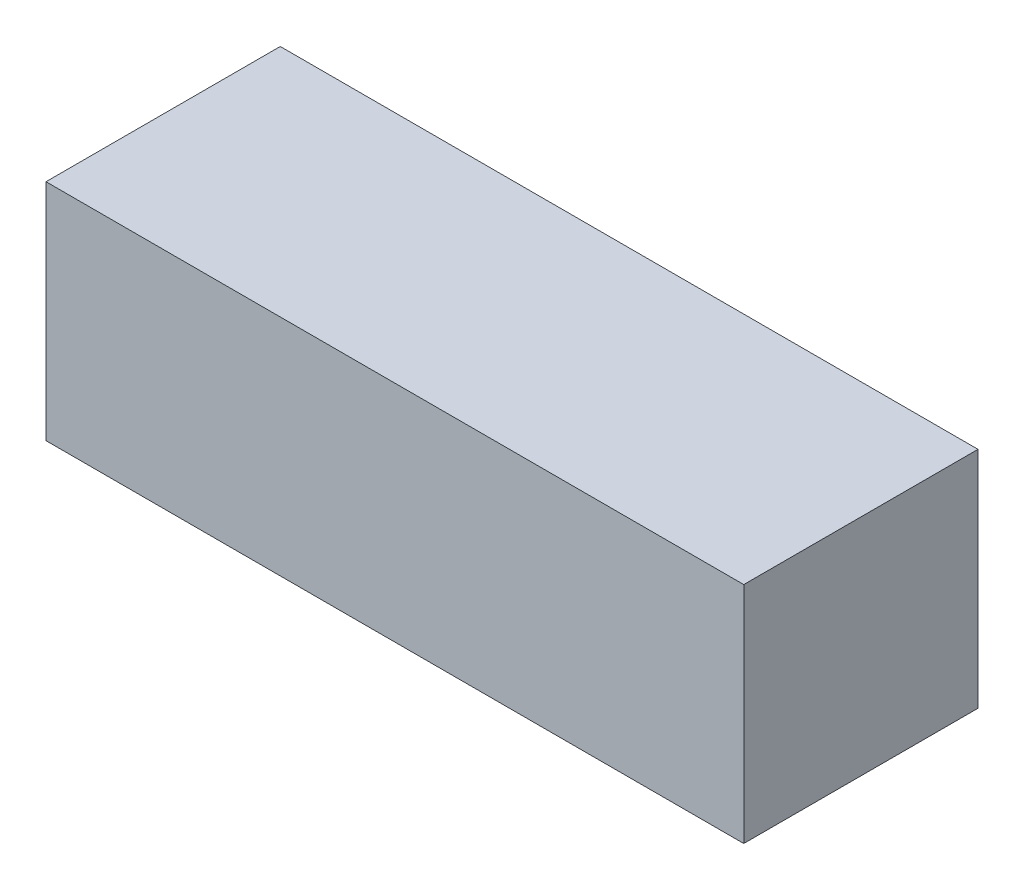
ISO-10303-21;
HEADER;
FILE_DESCRIPTION(('STEP AP214'),'2;1');
FILE_NAME('part.step','',(''),(''),'','','');
FILE_SCHEMA(('AUTOMOTIVE_DESIGN { 1 0 10303 214 1 1 1 1 }'));
ENDSEC;
DATA;
#1=APPLICATION_CONTEXT('core data for automotive mechanical design processes');
#2=APPLICATION_PROTOCOL_DEFINITION('international standard','automotive_design',2000,#1);
#3=PRODUCT_CONTEXT('',#1,'mechanical');
#4=PRODUCT('Part','Part','',(#3));
#5=PRODUCT_RELATED_PRODUCT_CATEGORY('part','',(#4));
#6=PRODUCT_DEFINITION_FORMATION('','',#4);
#7=PRODUCT_DEFINITION_CONTEXT('part definition',#1,'design');
#8=PRODUCT_DEFINITION('design','',#6,#7);
#9=PRODUCT_DEFINITION_SHAPE('','',#8);
#10=(LENGTH_UNIT() NAMED_UNIT(*) SI_UNIT(.MILLI.,.METRE.));
#11=(NAMED_UNIT(*) PLANE_ANGLE_UNIT() SI_UNIT($,.RADIAN.));
#12=(NAMED_UNIT(*) SI_UNIT($,.STERADIAN.) SOLID_ANGLE_UNIT());
#13=UNCERTAINTY_MEASURE_WITH_UNIT(LENGTH_MEASURE(1.E-05),#10,'distance_accuracy_value','');
#14=(GEOMETRIC_REPRESENTATION_CONTEXT(3) GLOBAL_UNCERTAINTY_ASSIGNED_CONTEXT((#13)) GLOBAL_UNIT_ASSIGNED_CONTEXT((#10,
#11,#12)) REPRESENTATION_CONTEXT('',''));
#15=CARTESIAN_POINT('',(0.,0.,0.));
#16=DIRECTION('',(0.,0.,1.));
#17=DIRECTION('',(1.,0.,0.));
#18=AXIS2_PLACEMENT_3D('',#15,#16,#17);
#19=CARTESIAN_POINT('',(0.,0.,47.));
#20=DIRECTION('',(1.,0.,0.));
#21=DIRECTION('',(0.,0.,-1.));
#22=AXIS2_PLACEMENT_3D('',#19,#20,#21);
#23=PLANE('',#22);
#24=DIRECTION('',(0.,-1.,0.));
#25=VECTOR('',#24,1.);
#26=CARTESIAN_POINT('',(0.,0.,0.));
#27=LINE('',#26,#25);
#28=CARTESIAN_POINT('',(0.,45.,0.));
#29=VERTEX_POINT('',#28);
#30=CARTESIAN_POINT('',(0.,0.,0.));
#31=VERTEX_POINT('',#30);
#32=EDGE_CURVE('E94',#29,#31,#27,.T.);
#33=ORIENTED_EDGE('',*,*,#32,.T.);
#34=DIRECTION('',(0.,0.,-1.));
#35=VECTOR('',#34,1.);
#36=CARTESIAN_POINT('',(0.,0.,47.));
#37=LINE('',#36,#35);
#38=CARTESIAN_POINT('',(0.,0.,47.));
#39=VERTEX_POINT('',#38);
#40=EDGE_CURVE('E11',#39,#31,#37,.T.);
#41=ORIENTED_EDGE('',*,*,#40,.F.);
#42=DIRECTION('',(0.,-1.,0.));
#43=VECTOR('',#42,1.);
#44=CARTESIAN_POINT('',(0.,0.,47.));
#45=LINE('',#44,#43);
#46=CARTESIAN_POINT('',(0.,45.,47.));
#47=VERTEX_POINT('',#46);
#48=EDGE_CURVE('E82',#47,#39,#45,.T.);
#49=ORIENTED_EDGE('',*,*,#48,.F.);
#50=DIRECTION('',(0.,0.,-1.));
#51=VECTOR('',#50,1.);
#52=CARTESIAN_POINT('',(0.,45.,47.));
#53=LINE('',#52,#51);
#54=EDGE_CURVE('E90',#47,#29,#53,.T.);
#55=ORIENTED_EDGE('',*,*,#54,.T.);
#56=EDGE_LOOP('',(#33,#41,#49,#55));
#57=FACE_BOUND('',#56,.T.);
#58=ADVANCED_FACE('F31',(#57),#23,.F.);
#59=CARTESIAN_POINT('',(0.,0.,47.));
#60=DIRECTION('',(0.,1.,0.));
#61=DIRECTION('',(0.,0.,1.));
#62=AXIS2_PLACEMENT_3D('',#59,#60,#61);
#63=PLANE('',#62);
#64=DIRECTION('',(1.,0.,0.));
#65=VECTOR('',#64,1.);
#66=CARTESIAN_POINT('',(0.,0.,0.));
#67=LINE('',#66,#65);
#68=CARTESIAN_POINT('',(140.,0.,0.));
#69=VERTEX_POINT('',#68);
#70=EDGE_CURVE('E86',#31,#69,#67,.T.);
#71=ORIENTED_EDGE('',*,*,#70,.T.);
#72=DIRECTION('',(0.,0.,-1.));
#73=VECTOR('',#72,1.);
#74=CARTESIAN_POINT('',(140.,0.,47.));
#75=LINE('',#74,#73);
#76=CARTESIAN_POINT('',(140.,0.,47.));
#77=VERTEX_POINT('',#76);
#78=EDGE_CURVE('E39',#77,#69,#75,.T.);
#79=ORIENTED_EDGE('',*,*,#78,.F.);
#80=DIRECTION('',(1.,0.,0.));
#81=VECTOR('',#80,1.);
#82=CARTESIAN_POINT('',(0.,0.,47.));
#83=LINE('',#82,#81);
#84=EDGE_CURVE('E77',#39,#77,#83,.T.);
#85=ORIENTED_EDGE('',*,*,#84,.F.);
#86=ORIENTED_EDGE('',*,*,#40,.T.);
#87=EDGE_LOOP('',(#71,#79,#85,#86));
#88=FACE_BOUND('',#87,.T.);
#89=ADVANCED_FACE('F85',(#88),#63,.F.);
#90=CARTESIAN_POINT('',(140.,0.,47.));
#91=DIRECTION('',(-1.,0.,0.));
#92=DIRECTION('',(0.,0.,1.));
#93=AXIS2_PLACEMENT_3D('',#90,#91,#92);
#94=PLANE('',#93);
#95=DIRECTION('',(0.,1.,0.));
#96=VECTOR('',#95,1.);
#97=CARTESIAN_POINT('',(140.,0.,0.));
#98=LINE('',#97,#96);
#99=CARTESIAN_POINT('',(140.,45.,0.));
#100=VERTEX_POINT('',#99);
#101=EDGE_CURVE('E64',#69,#100,#98,.T.);
#102=ORIENTED_EDGE('',*,*,#101,.T.);
#103=DIRECTION('',(0.,0.,-1.));
#104=VECTOR('',#103,1.);
#105=CARTESIAN_POINT('',(140.,45.,47.));
#106=LINE('',#105,#104);
#107=CARTESIAN_POINT('',(140.,45.,47.));
#108=VERTEX_POINT('',#107);
#109=EDGE_CURVE('E87',#108,#100,#106,.T.);
#110=ORIENTED_EDGE('',*,*,#109,.F.);
#111=DIRECTION('',(0.,1.,0.));
#112=VECTOR('',#111,1.);
#113=CARTESIAN_POINT('',(140.,0.,47.));
#114=LINE('',#113,#112);
#115=EDGE_CURVE('E80',#77,#108,#114,.T.);
#116=ORIENTED_EDGE('',*,*,#115,.F.);
#117=ORIENTED_EDGE('',*,*,#78,.T.);
#118=EDGE_LOOP('',(#102,#110,#116,#117));
#119=FACE_BOUND('',#118,.T.);
#120=ADVANCED_FACE('F88',(#119),#94,.F.);
#121=CARTESIAN_POINT('',(0.,45.,47.));
#122=DIRECTION('',(0.,-1.,0.));
#123=DIRECTION('',(0.,0.,-1.));
#124=AXIS2_PLACEMENT_3D('',#121,#122,#123);
#125=PLANE('',#124);
#126=DIRECTION('',(-1.,0.,0.));
#127=VECTOR('',#126,1.);
#128=CARTESIAN_POINT('',(0.,45.,0.));
#129=LINE('',#128,#127);
#130=EDGE_CURVE('E70',#100,#29,#129,.T.);
#131=ORIENTED_EDGE('',*,*,#130,.T.);
#132=ORIENTED_EDGE('',*,*,#54,.F.);
#133=DIRECTION('',(-1.,0.,0.));
#134=VECTOR('',#133,1.);
#135=CARTESIAN_POINT('',(0.,45.,47.));
#136=LINE('',#135,#134);
#137=EDGE_CURVE('E47',#108,#47,#136,.T.);
#138=ORIENTED_EDGE('',*,*,#137,.F.);
#139=ORIENTED_EDGE('',*,*,#109,.T.);
#140=EDGE_LOOP('',(#131,#132,#138,#139));
#141=FACE_BOUND('',#140,.T.);
#142=ADVANCED_FACE('F101',(#141),#125,.F.);
#143=CARTESIAN_POINT('',(0.,45.,47.));
#144=DIRECTION('',(0.,0.,-1.));
#145=DIRECTION('',(-1.,0.,0.));
#146=AXIS2_PLACEMENT_3D('',#143,#144,#145);
#147=PLANE('',#146);
#148=ORIENTED_EDGE('',*,*,#48,.T.);
#149=ORIENTED_EDGE('',*,*,#84,.T.);
#150=ORIENTED_EDGE('',*,*,#115,.T.);
#151=ORIENTED_EDGE('',*,*,#137,.T.);
#152=EDGE_LOOP('',(#148,#149,#150,#151));
#153=FACE_BOUND('',#152,.T.);
#154=ADVANCED_FACE('F78',(#153),#147,.F.);
#155=CARTESIAN_POINT('',(0.,45.,0.));
#156=DIRECTION('',(0.,0.,-1.));
#157=DIRECTION('',(-1.,0.,0.));
#158=AXIS2_PLACEMENT_3D('',#155,#156,#157);
#159=PLANE('',#158);
#160=ORIENTED_EDGE('',*,*,#32,.F.);
#161=ORIENTED_EDGE('',*,*,#130,.F.);
#162=ORIENTED_EDGE('',*,*,#101,.F.);
#163=ORIENTED_EDGE('',*,*,#70,.F.);
#164=EDGE_LOOP('',(#160,#161,#162,#163));
#165=FACE_BOUND('',#164,.T.);
#166=ADVANCED_FACE('F104',(#165),#159,.T.);
#167=CLOSED_SHELL('',(#58,#89,#120,#142,#154,#166));
#168=MANIFOLD_SOLID_BREP('B2',#167);
#169=ADVANCED_BREP_SHAPE_REPRESENTATION('',(#18,#168),#14);
#170=SHAPE_DEFINITION_REPRESENTATION(#9,#169);
ENDSEC;
END-ISO-10303-21;
